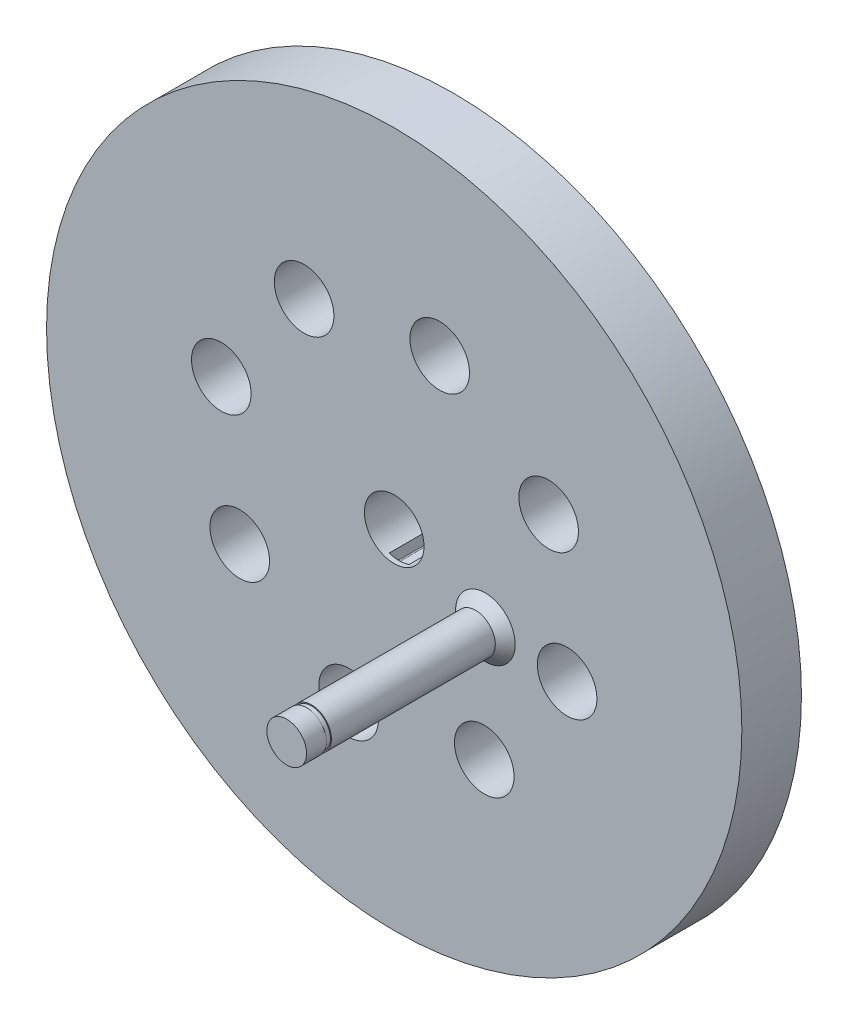
ISO-10303-21;
HEADER;
FILE_DESCRIPTION(('STEP AP214'),'2;1');
FILE_NAME('part.step','',(''),(''),'','','');
FILE_SCHEMA(('AUTOMOTIVE_DESIGN { 1 0 10303 214 1 1 1 1 }'));
ENDSEC;
DATA;
#1=APPLICATION_CONTEXT('core data for automotive mechanical design processes');
#2=APPLICATION_PROTOCOL_DEFINITION('international standard','automotive_design',2000,#1);
#3=PRODUCT_CONTEXT('',#1,'mechanical');
#4=PRODUCT('Part','Part','',(#3));
#5=PRODUCT_RELATED_PRODUCT_CATEGORY('part','',(#4));
#6=PRODUCT_DEFINITION_FORMATION('','',#4);
#7=PRODUCT_DEFINITION_CONTEXT('part definition',#1,'design');
#8=PRODUCT_DEFINITION('design','',#6,#7);
#9=PRODUCT_DEFINITION_SHAPE('','',#8);
#10=(LENGTH_UNIT() NAMED_UNIT(*) SI_UNIT(.MILLI.,.METRE.));
#11=(NAMED_UNIT(*) PLANE_ANGLE_UNIT() SI_UNIT($,.RADIAN.));
#12=(NAMED_UNIT(*) SI_UNIT($,.STERADIAN.) SOLID_ANGLE_UNIT());
#13=UNCERTAINTY_MEASURE_WITH_UNIT(LENGTH_MEASURE(1.E-05),#10,'distance_accuracy_value','');
#14=(GEOMETRIC_REPRESENTATION_CONTEXT(3) GLOBAL_UNCERTAINTY_ASSIGNED_CONTEXT((#13)) GLOBAL_UNIT_ASSIGNED_CONTEXT((#10,
#11,#12)) REPRESENTATION_CONTEXT('',''));
#15=CARTESIAN_POINT('',(0.,0.,0.));
#16=DIRECTION('',(0.,0.,1.));
#17=DIRECTION('',(1.,0.,0.));
#18=AXIS2_PLACEMENT_3D('',#15,#16,#17);
#19=CARTESIAN_POINT('',(9.17867077053944,-3.96887929849786,28.));
#20=DIRECTION('',(0.,0.,-1.));
#21=DIRECTION('',(-1.,0.,0.));
#22=AXIS2_PLACEMENT_3D('',#19,#20,#21);
#23=CYLINDRICAL_SURFACE('',#22,2.);
#24=CARTESIAN_POINT('',(9.17867077053944,-3.96887929849786,6.99999999999997));
#25=DIRECTION('',(0.,0.,1.));
#26=DIRECTION('',(1.,0.,0.));
#27=AXIS2_PLACEMENT_3D('',#24,#25,#26);
#28=CIRCLE('',#27,2.);
#29=CARTESIAN_POINT('',(11.1786707705394,-3.96887929849786,6.99999999999997));
#30=VERTEX_POINT('',#29);
#31=EDGE_CURVE('E266',#30,#30,#28,.T.);
#32=ORIENTED_EDGE('',*,*,#31,.T.);
#33=EDGE_LOOP('',(#32));
#34=FACE_BOUND('',#33,.T.);
#35=CARTESIAN_POINT('',(9.17867077053944,-3.96887929849786,23.5));
#36=DIRECTION('',(0.,0.,1.));
#37=DIRECTION('',(1.,0.,0.));
#38=AXIS2_PLACEMENT_3D('',#35,#36,#37);
#39=CIRCLE('',#38,2.);
#40=CARTESIAN_POINT('',(11.1786707705394,-3.96887929849786,23.5));
#41=VERTEX_POINT('',#40);
#42=EDGE_CURVE('E295',#41,#41,#39,.T.);
#43=ORIENTED_EDGE('',*,*,#42,.F.);
#44=EDGE_LOOP('',(#43));
#45=FACE_BOUND('',#44,.T.);
#46=ADVANCED_FACE('F55',(#34,#45),#23,.T.);
#47=CARTESIAN_POINT('',(0.,0.,6.));
#48=DIRECTION('',(0.,0.,-1.));
#49=DIRECTION('',(-1.,0.,0.));
#50=AXIS2_PLACEMENT_3D('',#47,#48,#49);
#51=CYLINDRICAL_SURFACE('',#50,3.);
#52=CARTESIAN_POINT('',(0.,0.,6.));
#53=DIRECTION('',(0.,0.,1.));
#54=DIRECTION('',(1.,0.,0.));
#55=AXIS2_PLACEMENT_3D('',#52,#53,#54);
#56=CIRCLE('',#55,3.);
#57=CARTESIAN_POINT('',(3.,0.,6.));
#58=VERTEX_POINT('',#57);
#59=EDGE_CURVE('E254',#58,#58,#56,.T.);
#60=ORIENTED_EDGE('',*,*,#59,.T.);
#61=EDGE_LOOP('',(#60));
#62=FACE_BOUND('',#61,.T.);
#63=CARTESIAN_POINT('',(0.,0.,0.));
#64=DIRECTION('',(0.,0.,1.));
#65=DIRECTION('',(1.,0.,0.));
#66=AXIS2_PLACEMENT_3D('',#63,#64,#65);
#67=CIRCLE('',#66,3.);
#68=CARTESIAN_POINT('',(3.,0.,0.));
#69=VERTEX_POINT('',#68);
#70=EDGE_CURVE('E250',#69,#69,#67,.T.);
#71=ORIENTED_EDGE('',*,*,#70,.F.);
#72=EDGE_LOOP('',(#71));
#73=FACE_BOUND('',#72,.T.);
#74=DIRECTION('',(0.,0.,-1.));
#75=VECTOR('',#74,1.);
#76=CARTESIAN_POINT('',(-0.999999999999999,-2.82842712474619,6.));
#77=LINE('',#76,#75);
#78=CARTESIAN_POINT('',(-0.999999999999999,-2.82842712474619,1.5));
#79=VERTEX_POINT('',#78);
#80=CARTESIAN_POINT('',(-0.999999999999999,-2.82842712474619,5.5));
#81=VERTEX_POINT('',#80);
#82=EDGE_CURVE('E132',#79,#81,#77,.F.);
#83=ORIENTED_EDGE('',*,*,#82,.F.);
#84=CARTESIAN_POINT('',(0.,0.,1.5));
#85=DIRECTION('',(0.,0.,1.));
#86=DIRECTION('',(1.,0.,0.));
#87=AXIS2_PLACEMENT_3D('',#84,#85,#86);
#88=CIRCLE('',#87,3.);
#89=CARTESIAN_POINT('',(1.,-2.82842712474619,1.5));
#90=VERTEX_POINT('',#89);
#91=EDGE_CURVE('E136',#79,#90,#88,.T.);
#92=ORIENTED_EDGE('',*,*,#91,.T.);
#93=DIRECTION('',(0.,0.,-1.));
#94=VECTOR('',#93,1.);
#95=CARTESIAN_POINT('',(1.,-2.82842712474619,6.));
#96=LINE('',#95,#94);
#97=CARTESIAN_POINT('',(1.,-2.82842712474619,5.5));
#98=VERTEX_POINT('',#97);
#99=EDGE_CURVE('E116',#98,#90,#96,.T.);
#100=ORIENTED_EDGE('',*,*,#99,.F.);
#101=CARTESIAN_POINT('',(0.,0.,5.5));
#102=DIRECTION('',(0.,0.,1.));
#103=DIRECTION('',(1.,0.,0.));
#104=AXIS2_PLACEMENT_3D('',#101,#102,#103);
#105=CIRCLE('',#104,3.);
#106=EDGE_CURVE('E125',#81,#98,#105,.T.);
#107=ORIENTED_EDGE('',*,*,#106,.F.);
#108=EDGE_LOOP('',(#83,#92,#100,#107));
#109=FACE_BOUND('',#108,.T.);
#110=ADVANCED_FACE('F135',(#62,#73,#109),#51,.F.);
#111=CARTESIAN_POINT('',(0.,0.,6.));
#112=DIRECTION('',(0.,0.,1.));
#113=DIRECTION('',(1.,0.,0.));
#114=AXIS2_PLACEMENT_3D('',#111,#112,#113);
#115=PLANE('',#114);
#116=CARTESIAN_POINT('',(9.17867077053944,-3.96887929849786,6.));
#117=DIRECTION('',(0.,0.,1.));
#118=DIRECTION('',(1.,0.,0.));
#119=AXIS2_PLACEMENT_3D('',#116,#117,#118);
#120=CIRCLE('',#119,2.99999999999996);
#121=CARTESIAN_POINT('',(12.1786707705394,-3.96887929849786,6.));
#122=VERTEX_POINT('',#121);
#123=EDGE_CURVE('E133',#122,#122,#120,.F.);
#124=ORIENTED_EDGE('',*,*,#123,.T.);
#125=EDGE_LOOP('',(#124));
#126=FACE_BOUND('',#125,.T.);
#127=CARTESIAN_POINT('',(15.548658842396,9.06858358305098,6.));
#128=DIRECTION('',(0.,0.,-1.));
#129=DIRECTION('',(-1.,0.,0.));
#130=AXIS2_PLACEMENT_3D('',#127,#128,#129);
#131=CIRCLE('',#130,3.);
#132=CARTESIAN_POINT('',(12.548658842396,9.06858358305098,6.));
#133=VERTEX_POINT('',#132);
#134=EDGE_CURVE('E177',#133,#133,#131,.T.);
#135=ORIENTED_EDGE('',*,*,#134,.T.);
#136=EDGE_LOOP('',(#135));
#137=FACE_BOUND('',#136,.T.);
#138=CARTESIAN_POINT('',(17.4070190531467,-4.58210515848203,6.));
#139=DIRECTION('',(0.,0.,-1.));
#140=DIRECTION('',(-1.,0.,0.));
#141=AXIS2_PLACEMENT_3D('',#138,#139,#140);
#142=CIRCLE('',#141,3.);
#143=CARTESIAN_POINT('',(14.4070190531467,-4.58210515848203,6.));
#144=VERTEX_POINT('',#143);
#145=EDGE_CURVE('E235',#144,#144,#142,.T.);
#146=ORIENTED_EDGE('',*,*,#145,.T.);
#147=EDGE_LOOP('',(#146));
#148=FACE_BOUND('',#147,.T.);
#149=CARTESIAN_POINT('',(9.06858358305099,-15.5486588423959,6.));
#150=DIRECTION('',(0.,0.,-1.));
#151=DIRECTION('',(-1.,0.,0.));
#152=AXIS2_PLACEMENT_3D('',#149,#150,#151);
#153=CIRCLE('',#152,3.);
#154=CARTESIAN_POINT('',(6.06858358305099,-15.5486588423959,6.));
#155=VERTEX_POINT('',#154);
#156=EDGE_CURVE('E227',#155,#155,#153,.T.);
#157=ORIENTED_EDGE('',*,*,#156,.T.);
#158=EDGE_LOOP('',(#157));
#159=FACE_BOUND('',#158,.T.);
#160=CARTESIAN_POINT('',(-4.58210515848203,-17.4070190531467,6.));
#161=DIRECTION('',(0.,0.,-1.));
#162=DIRECTION('',(-1.,0.,0.));
#163=AXIS2_PLACEMENT_3D('',#160,#161,#162);
#164=CIRCLE('',#163,3.);
#165=CARTESIAN_POINT('',(-7.58210515848203,-17.4070190531467,6.));
#166=VERTEX_POINT('',#165);
#167=EDGE_CURVE('E219',#166,#166,#164,.T.);
#168=ORIENTED_EDGE('',*,*,#167,.T.);
#169=EDGE_LOOP('',(#168));
#170=FACE_BOUND('',#169,.T.);
#171=CARTESIAN_POINT('',(-15.548658842396,-9.06858358305097,6.));
#172=DIRECTION('',(0.,0.,-1.));
#173=DIRECTION('',(-1.,0.,0.));
#174=AXIS2_PLACEMENT_3D('',#171,#172,#173);
#175=CIRCLE('',#174,3.);
#176=CARTESIAN_POINT('',(-18.548658842396,-9.06858358305097,6.));
#177=VERTEX_POINT('',#176);
#178=EDGE_CURVE('E211',#177,#177,#175,.T.);
#179=ORIENTED_EDGE('',*,*,#178,.T.);
#180=EDGE_LOOP('',(#179));
#181=FACE_BOUND('',#180,.T.);
#182=CARTESIAN_POINT('',(-17.4070190531467,4.58210515848202,6.));
#183=DIRECTION('',(0.,0.,-1.));
#184=DIRECTION('',(-1.,0.,0.));
#185=AXIS2_PLACEMENT_3D('',#182,#183,#184);
#186=CIRCLE('',#185,2.99999999999999);
#187=CARTESIAN_POINT('',(-20.4070190531467,4.58210515848202,6.));
#188=VERTEX_POINT('',#187);
#189=EDGE_CURVE('E203',#188,#188,#186,.T.);
#190=ORIENTED_EDGE('',*,*,#189,.T.);
#191=EDGE_LOOP('',(#190));
#192=FACE_BOUND('',#191,.T.);
#193=CARTESIAN_POINT('',(-9.06858358305098,15.548658842396,6.));
#194=DIRECTION('',(0.,0.,-1.));
#195=DIRECTION('',(-1.,0.,0.));
#196=AXIS2_PLACEMENT_3D('',#193,#194,#195);
#197=CIRCLE('',#196,3.);
#198=CARTESIAN_POINT('',(-12.068583583051,15.548658842396,6.));
#199=VERTEX_POINT('',#198);
#200=EDGE_CURVE('E195',#199,#199,#197,.T.);
#201=ORIENTED_EDGE('',*,*,#200,.T.);
#202=EDGE_LOOP('',(#201));
#203=FACE_BOUND('',#202,.T.);
#204=CARTESIAN_POINT('',(4.58210515848201,17.4070190531467,6.));
#205=DIRECTION('',(0.,0.,-1.));
#206=DIRECTION('',(-1.,0.,0.));
#207=AXIS2_PLACEMENT_3D('',#204,#205,#206);
#208=CIRCLE('',#207,3.);
#209=CARTESIAN_POINT('',(1.58210515848201,17.4070190531467,6.));
#210=VERTEX_POINT('',#209);
#211=EDGE_CURVE('E246',#210,#210,#208,.T.);
#212=ORIENTED_EDGE('',*,*,#211,.T.);
#213=EDGE_LOOP('',(#212));
#214=FACE_BOUND('',#213,.T.);
#215=CARTESIAN_POINT('',(0.,0.,6.));
#216=DIRECTION('',(0.,0.,1.));
#217=DIRECTION('',(1.,0.,0.));
#218=AXIS2_PLACEMENT_3D('',#215,#216,#217);
#219=CIRCLE('',#218,35.);
#220=CARTESIAN_POINT('',(35.,0.,6.));
#221=VERTEX_POINT('',#220);
#222=EDGE_CURVE('E262',#221,#221,#219,.T.);
#223=ORIENTED_EDGE('',*,*,#222,.T.);
#224=EDGE_LOOP('',(#223));
#225=FACE_BOUND('',#224,.T.);
#226=ORIENTED_EDGE('',*,*,#59,.F.);
#227=EDGE_LOOP('',(#226));
#228=FACE_BOUND('',#227,.T.);
#229=ADVANCED_FACE('F279',(#126,#137,#148,#159,#170,#181,#192,#203,#214,#225,#228),#115,.T.);
#230=CARTESIAN_POINT('',(0.,0.,0.));
#231=DIRECTION('',(0.,0.,1.));
#232=DIRECTION('',(1.,0.,0.));
#233=AXIS2_PLACEMENT_3D('',#230,#231,#232);
#234=PLANE('',#233);
#235=CARTESIAN_POINT('',(15.548658842396,9.06858358305098,0.));
#236=DIRECTION('',(0.,0.,-1.));
#237=DIRECTION('',(-1.,0.,0.));
#238=AXIS2_PLACEMENT_3D('',#235,#236,#237);
#239=CIRCLE('',#238,3.);
#240=CARTESIAN_POINT('',(12.548658842396,9.06858358305098,0.));
#241=VERTEX_POINT('',#240);
#242=EDGE_CURVE('E239',#241,#241,#239,.T.);
#243=ORIENTED_EDGE('',*,*,#242,.F.);
#244=EDGE_LOOP('',(#243));
#245=FACE_BOUND('',#244,.T.);
#246=CARTESIAN_POINT('',(17.4070190531467,-4.58210515848203,0.));
#247=DIRECTION('',(0.,0.,-1.));
#248=DIRECTION('',(-1.,0.,0.));
#249=AXIS2_PLACEMENT_3D('',#246,#247,#248);
#250=CIRCLE('',#249,3.);
#251=CARTESIAN_POINT('',(14.4070190531467,-4.58210515848203,0.));
#252=VERTEX_POINT('',#251);
#253=EDGE_CURVE('E231',#252,#252,#250,.T.);
#254=ORIENTED_EDGE('',*,*,#253,.F.);
#255=EDGE_LOOP('',(#254));
#256=FACE_BOUND('',#255,.T.);
#257=CARTESIAN_POINT('',(9.06858358305099,-15.5486588423959,0.));
#258=DIRECTION('',(0.,0.,-1.));
#259=DIRECTION('',(-1.,0.,0.));
#260=AXIS2_PLACEMENT_3D('',#257,#258,#259);
#261=CIRCLE('',#260,3.);
#262=CARTESIAN_POINT('',(6.06858358305099,-15.5486588423959,0.));
#263=VERTEX_POINT('',#262);
#264=EDGE_CURVE('E223',#263,#263,#261,.T.);
#265=ORIENTED_EDGE('',*,*,#264,.F.);
#266=EDGE_LOOP('',(#265));
#267=FACE_BOUND('',#266,.T.);
#268=CARTESIAN_POINT('',(-4.58210515848203,-17.4070190531467,0.));
#269=DIRECTION('',(0.,0.,-1.));
#270=DIRECTION('',(-1.,0.,0.));
#271=AXIS2_PLACEMENT_3D('',#268,#269,#270);
#272=CIRCLE('',#271,3.);
#273=CARTESIAN_POINT('',(-7.58210515848203,-17.4070190531467,0.));
#274=VERTEX_POINT('',#273);
#275=EDGE_CURVE('E215',#274,#274,#272,.T.);
#276=ORIENTED_EDGE('',*,*,#275,.F.);
#277=EDGE_LOOP('',(#276));
#278=FACE_BOUND('',#277,.T.);
#279=CARTESIAN_POINT('',(-15.548658842396,-9.06858358305097,0.));
#280=DIRECTION('',(0.,0.,-1.));
#281=DIRECTION('',(-1.,0.,0.));
#282=AXIS2_PLACEMENT_3D('',#279,#280,#281);
#283=CIRCLE('',#282,3.);
#284=CARTESIAN_POINT('',(-18.548658842396,-9.06858358305097,0.));
#285=VERTEX_POINT('',#284);
#286=EDGE_CURVE('E207',#285,#285,#283,.T.);
#287=ORIENTED_EDGE('',*,*,#286,.F.);
#288=EDGE_LOOP('',(#287));
#289=FACE_BOUND('',#288,.T.);
#290=CARTESIAN_POINT('',(-17.4070190531467,4.58210515848202,0.));
#291=DIRECTION('',(0.,0.,-1.));
#292=DIRECTION('',(-1.,0.,0.));
#293=AXIS2_PLACEMENT_3D('',#290,#291,#292);
#294=CIRCLE('',#293,2.99999999999999);
#295=CARTESIAN_POINT('',(-20.4070190531467,4.58210515848202,0.));
#296=VERTEX_POINT('',#295);
#297=EDGE_CURVE('E199',#296,#296,#294,.T.);
#298=ORIENTED_EDGE('',*,*,#297,.F.);
#299=EDGE_LOOP('',(#298));
#300=FACE_BOUND('',#299,.T.);
#301=CARTESIAN_POINT('',(-9.06858358305098,15.548658842396,0.));
#302=DIRECTION('',(0.,0.,-1.));
#303=DIRECTION('',(-1.,0.,0.));
#304=AXIS2_PLACEMENT_3D('',#301,#302,#303);
#305=CIRCLE('',#304,3.);
#306=CARTESIAN_POINT('',(-12.068583583051,15.548658842396,0.));
#307=VERTEX_POINT('',#306);
#308=EDGE_CURVE('E190',#307,#307,#305,.T.);
#309=ORIENTED_EDGE('',*,*,#308,.F.);
#310=EDGE_LOOP('',(#309));
#311=FACE_BOUND('',#310,.T.);
#312=CARTESIAN_POINT('',(4.58210515848201,17.4070190531467,0.));
#313=DIRECTION('',(0.,0.,-1.));
#314=DIRECTION('',(-1.,0.,0.));
#315=AXIS2_PLACEMENT_3D('',#312,#313,#314);
#316=CIRCLE('',#315,3.);
#317=CARTESIAN_POINT('',(1.58210515848201,17.4070190531467,0.));
#318=VERTEX_POINT('',#317);
#319=EDGE_CURVE('E194',#318,#318,#316,.T.);
#320=ORIENTED_EDGE('',*,*,#319,.F.);
#321=EDGE_LOOP('',(#320));
#322=FACE_BOUND('',#321,.T.);
#323=CARTESIAN_POINT('',(0.,0.,0.));
#324=DIRECTION('',(0.,0.,1.));
#325=DIRECTION('',(1.,0.,0.));
#326=AXIS2_PLACEMENT_3D('',#323,#324,#325);
#327=CIRCLE('',#326,35.);
#328=CARTESIAN_POINT('',(35.,0.,0.));
#329=VERTEX_POINT('',#328);
#330=EDGE_CURVE('E258',#329,#329,#327,.T.);
#331=ORIENTED_EDGE('',*,*,#330,.F.);
#332=EDGE_LOOP('',(#331));
#333=FACE_BOUND('',#332,.T.);
#334=ORIENTED_EDGE('',*,*,#70,.T.);
#335=EDGE_LOOP('',(#334));
#336=FACE_BOUND('',#335,.T.);
#337=ADVANCED_FACE('F409',(#245,#256,#267,#278,#289,#300,#311,#322,#333,#336),#234,.F.);
#338=CARTESIAN_POINT('',(0.,0.,6.));
#339=DIRECTION('',(0.,0.,-1.));
#340=DIRECTION('',(-1.,0.,0.));
#341=AXIS2_PLACEMENT_3D('',#338,#339,#340);
#342=CYLINDRICAL_SURFACE('',#341,35.);
#343=ORIENTED_EDGE('',*,*,#222,.F.);
#344=EDGE_LOOP('',(#343));
#345=FACE_BOUND('',#344,.T.);
#346=ORIENTED_EDGE('',*,*,#330,.T.);
#347=EDGE_LOOP('',(#346));
#348=FACE_BOUND('',#347,.T.);
#349=ADVANCED_FACE('F402',(#345,#348),#342,.T.);
#350=CARTESIAN_POINT('',(4.58210515848201,17.4070190531467,6.));
#351=DIRECTION('',(0.,0.,-1.));
#352=DIRECTION('',(-1.,0.,0.));
#353=AXIS2_PLACEMENT_3D('',#350,#351,#352);
#354=CYLINDRICAL_SURFACE('',#353,3.);
#355=ORIENTED_EDGE('',*,*,#211,.F.);
#356=EDGE_LOOP('',(#355));
#357=FACE_BOUND('',#356,.T.);
#358=ORIENTED_EDGE('',*,*,#319,.T.);
#359=EDGE_LOOP('',(#358));
#360=FACE_BOUND('',#359,.T.);
#361=ADVANCED_FACE('F376',(#357,#360),#354,.F.);
#362=CARTESIAN_POINT('',(-9.06858358305098,15.548658842396,6.));
#363=DIRECTION('',(0.,0.,-1.));
#364=DIRECTION('',(-1.,0.,0.));
#365=AXIS2_PLACEMENT_3D('',#362,#363,#364);
#366=CYLINDRICAL_SURFACE('',#365,3.);
#367=ORIENTED_EDGE('',*,*,#200,.F.);
#368=EDGE_LOOP('',(#367));
#369=FACE_BOUND('',#368,.T.);
#370=ORIENTED_EDGE('',*,*,#308,.T.);
#371=EDGE_LOOP('',(#370));
#372=FACE_BOUND('',#371,.T.);
#373=ADVANCED_FACE('F372',(#369,#372),#366,.F.);
#374=CARTESIAN_POINT('',(-17.4070190531467,4.58210515848202,6.));
#375=DIRECTION('',(0.,0.,-1.));
#376=DIRECTION('',(-1.,0.,0.));
#377=AXIS2_PLACEMENT_3D('',#374,#375,#376);
#378=CYLINDRICAL_SURFACE('',#377,2.99999999999999);
#379=ORIENTED_EDGE('',*,*,#189,.F.);
#380=EDGE_LOOP('',(#379));
#381=FACE_BOUND('',#380,.T.);
#382=ORIENTED_EDGE('',*,*,#297,.T.);
#383=EDGE_LOOP('',(#382));
#384=FACE_BOUND('',#383,.T.);
#385=ADVANCED_FACE('F375',(#381,#384),#378,.F.);
#386=CARTESIAN_POINT('',(-15.548658842396,-9.06858358305097,6.));
#387=DIRECTION('',(0.,0.,-1.));
#388=DIRECTION('',(-1.,0.,0.));
#389=AXIS2_PLACEMENT_3D('',#386,#387,#388);
#390=CYLINDRICAL_SURFACE('',#389,3.);
#391=ORIENTED_EDGE('',*,*,#178,.F.);
#392=EDGE_LOOP('',(#391));
#393=FACE_BOUND('',#392,.T.);
#394=ORIENTED_EDGE('',*,*,#286,.T.);
#395=EDGE_LOOP('',(#394));
#396=FACE_BOUND('',#395,.T.);
#397=ADVANCED_FACE('F380',(#393,#396),#390,.F.);
#398=CARTESIAN_POINT('',(-4.58210515848203,-17.4070190531467,6.));
#399=DIRECTION('',(0.,0.,-1.));
#400=DIRECTION('',(-1.,0.,0.));
#401=AXIS2_PLACEMENT_3D('',#398,#399,#400);
#402=CYLINDRICAL_SURFACE('',#401,3.);
#403=ORIENTED_EDGE('',*,*,#167,.F.);
#404=EDGE_LOOP('',(#403));
#405=FACE_BOUND('',#404,.T.);
#406=ORIENTED_EDGE('',*,*,#275,.T.);
#407=EDGE_LOOP('',(#406));
#408=FACE_BOUND('',#407,.T.);
#409=ADVANCED_FACE('F384',(#405,#408),#402,.F.);
#410=CARTESIAN_POINT('',(9.06858358305099,-15.5486588423959,6.));
#411=DIRECTION('',(0.,0.,-1.));
#412=DIRECTION('',(-1.,0.,0.));
#413=AXIS2_PLACEMENT_3D('',#410,#411,#412);
#414=CYLINDRICAL_SURFACE('',#413,3.);
#415=ORIENTED_EDGE('',*,*,#156,.F.);
#416=EDGE_LOOP('',(#415));
#417=FACE_BOUND('',#416,.T.);
#418=ORIENTED_EDGE('',*,*,#264,.T.);
#419=EDGE_LOOP('',(#418));
#420=FACE_BOUND('',#419,.T.);
#421=ADVANCED_FACE('F388',(#417,#420),#414,.F.);
#422=CARTESIAN_POINT('',(17.4070190531467,-4.58210515848203,6.));
#423=DIRECTION('',(0.,0.,-1.));
#424=DIRECTION('',(-1.,0.,0.));
#425=AXIS2_PLACEMENT_3D('',#422,#423,#424);
#426=CYLINDRICAL_SURFACE('',#425,3.);
#427=ORIENTED_EDGE('',*,*,#145,.F.);
#428=EDGE_LOOP('',(#427));
#429=FACE_BOUND('',#428,.T.);
#430=ORIENTED_EDGE('',*,*,#253,.T.);
#431=EDGE_LOOP('',(#430));
#432=FACE_BOUND('',#431,.T.);
#433=ADVANCED_FACE('F392',(#429,#432),#426,.F.);
#434=CARTESIAN_POINT('',(15.548658842396,9.06858358305098,6.));
#435=DIRECTION('',(0.,0.,-1.));
#436=DIRECTION('',(-1.,0.,0.));
#437=AXIS2_PLACEMENT_3D('',#434,#435,#436);
#438=CYLINDRICAL_SURFACE('',#437,3.);
#439=ORIENTED_EDGE('',*,*,#134,.F.);
#440=EDGE_LOOP('',(#439));
#441=FACE_BOUND('',#440,.T.);
#442=ORIENTED_EDGE('',*,*,#242,.T.);
#443=EDGE_LOOP('',(#442));
#444=FACE_BOUND('',#443,.T.);
#445=ADVANCED_FACE('F285',(#441,#444),#438,.F.);
#446=CARTESIAN_POINT('',(9.17867077053944,-3.96887929849786,6.99999999999997));
#447=DIRECTION('',(0.,0.,-1.));
#448=DIRECTION('',(-1.,0.,0.));
#449=AXIS2_PLACEMENT_3D('',#446,#447,#448);
#450=CONICAL_SURFACE('',#449,2.,0.785398163397444);
#451=ORIENTED_EDGE('',*,*,#123,.F.);
#452=EDGE_LOOP('',(#451));
#453=FACE_BOUND('',#452,.T.);
#454=ORIENTED_EDGE('',*,*,#31,.F.);
#455=EDGE_LOOP('',(#454));
#456=FACE_BOUND('',#455,.T.);
#457=ADVANCED_FACE('F282',(#453,#456),#450,.T.);
#458=CARTESIAN_POINT('',(1.,-2.,1.5));
#459=DIRECTION('',(1.,0.,0.));
#460=DIRECTION('',(0.,0.,-1.));
#461=AXIS2_PLACEMENT_3D('',#458,#459,#460);
#462=PLANE('',#461);
#463=DIRECTION('',(0.,1.,0.));
#464=VECTOR('',#463,1.);
#465=CARTESIAN_POINT('',(1.,-2.,1.5));
#466=LINE('',#465,#464);
#467=CARTESIAN_POINT('',(1.,-3.9,1.5));
#468=VERTEX_POINT('',#467);
#469=EDGE_CURVE('E187',#468,#90,#466,.T.);
#470=ORIENTED_EDGE('',*,*,#469,.F.);
#471=DIRECTION('',(0.,0.,1.));
#472=VECTOR('',#471,1.);
#473=CARTESIAN_POINT('',(1.,-3.9,5.5));
#474=LINE('',#473,#472);
#475=CARTESIAN_POINT('',(1.,-3.9,5.5));
#476=VERTEX_POINT('',#475);
#477=EDGE_CURVE('E11',#468,#476,#474,.T.);
#478=ORIENTED_EDGE('',*,*,#477,.T.);
#479=DIRECTION('',(0.,1.,0.));
#480=VECTOR('',#479,1.);
#481=CARTESIAN_POINT('',(1.,-2.,5.5));
#482=LINE('',#481,#480);
#483=EDGE_CURVE('E112',#476,#98,#482,.T.);
#484=ORIENTED_EDGE('',*,*,#483,.T.);
#485=ORIENTED_EDGE('',*,*,#99,.T.);
#486=EDGE_LOOP('',(#470,#478,#484,#485));
#487=FACE_BOUND('',#486,.T.);
#488=ADVANCED_FACE('F114',(#487),#462,.F.);
#489=CARTESIAN_POINT('',(-0.999999999999999,-4.,1.5));
#490=DIRECTION('',(0.,-1.,0.));
#491=DIRECTION('',(0.,0.,-1.));
#492=AXIS2_PLACEMENT_3D('',#489,#490,#491);
#493=PLANE('',#492);
#494=DIRECTION('',(1.,0.,0.));
#495=VECTOR('',#494,1.);
#496=CARTESIAN_POINT('',(-0.999999999999999,-4.,1.5));
#497=LINE('',#496,#495);
#498=CARTESIAN_POINT('',(-0.899999999999999,-4.,1.5));
#499=VERTEX_POINT('',#498);
#500=CARTESIAN_POINT('',(0.900000000000001,-4.,1.5));
#501=VERTEX_POINT('',#500);
#502=EDGE_CURVE('E168',#499,#501,#497,.T.);
#503=ORIENTED_EDGE('',*,*,#502,.F.);
#504=DIRECTION('',(0.,0.,1.));
#505=VECTOR('',#504,1.);
#506=CARTESIAN_POINT('',(-0.899999999999999,-4.,5.5));
#507=LINE('',#506,#505);
#508=CARTESIAN_POINT('',(-0.899999999999999,-4.,5.5));
#509=VERTEX_POINT('',#508);
#510=EDGE_CURVE('E149',#499,#509,#507,.T.);
#511=ORIENTED_EDGE('',*,*,#510,.T.);
#512=DIRECTION('',(1.,0.,0.));
#513=VECTOR('',#512,1.);
#514=CARTESIAN_POINT('',(-0.999999999999999,-4.,5.5));
#515=LINE('',#514,#513);
#516=CARTESIAN_POINT('',(0.900000000000001,-4.,5.5));
#517=VERTEX_POINT('',#516);
#518=EDGE_CURVE('E180',#509,#517,#515,.T.);
#519=ORIENTED_EDGE('',*,*,#518,.T.);
#520=DIRECTION('',(0.,0.,1.));
#521=VECTOR('',#520,1.);
#522=CARTESIAN_POINT('',(0.900000000000001,-4.,1.5));
#523=LINE('',#522,#521);
#524=EDGE_CURVE('E143',#517,#501,#523,.F.);
#525=ORIENTED_EDGE('',*,*,#524,.T.);
#526=EDGE_LOOP('',(#503,#511,#519,#525));
#527=FACE_BOUND('',#526,.T.);
#528=ADVANCED_FACE('F173',(#527),#493,.F.);
#529=CARTESIAN_POINT('',(-0.999999999999999,-2.,1.5));
#530=DIRECTION('',(-1.,0.,0.));
#531=DIRECTION('',(0.,0.,1.));
#532=AXIS2_PLACEMENT_3D('',#529,#530,#531);
#533=PLANE('',#532);
#534=DIRECTION('',(0.,-1.,0.));
#535=VECTOR('',#534,1.);
#536=CARTESIAN_POINT('',(-0.999999999999999,-2.,5.5));
#537=LINE('',#536,#535);
#538=CARTESIAN_POINT('',(-0.999999999999999,-3.9,5.5));
#539=VERTEX_POINT('',#538);
#540=EDGE_CURVE('E121',#81,#539,#537,.T.);
#541=ORIENTED_EDGE('',*,*,#540,.T.);
#542=DIRECTION('',(0.,0.,1.));
#543=VECTOR('',#542,1.);
#544=CARTESIAN_POINT('',(-0.999999999999999,-3.9,1.5));
#545=LINE('',#544,#543);
#546=CARTESIAN_POINT('',(-0.999999999999999,-3.9,1.5));
#547=VERTEX_POINT('',#546);
#548=EDGE_CURVE('E79',#539,#547,#545,.F.);
#549=ORIENTED_EDGE('',*,*,#548,.T.);
#550=DIRECTION('',(0.,-1.,0.));
#551=VECTOR('',#550,1.);
#552=CARTESIAN_POINT('',(-0.999999999999999,-2.,1.5));
#553=LINE('',#552,#551);
#554=EDGE_CURVE('E169',#79,#547,#553,.T.);
#555=ORIENTED_EDGE('',*,*,#554,.F.);
#556=ORIENTED_EDGE('',*,*,#82,.T.);
#557=EDGE_LOOP('',(#541,#549,#555,#556));
#558=FACE_BOUND('',#557,.T.);
#559=ADVANCED_FACE('F181',(#558),#533,.F.);
#560=CARTESIAN_POINT('',(0.,0.,1.5));
#561=DIRECTION('',(0.,0.,1.));
#562=DIRECTION('',(1.,0.,0.));
#563=AXIS2_PLACEMENT_3D('',#560,#561,#562);
#564=PLANE('',#563);
#565=ORIENTED_EDGE('',*,*,#554,.T.);
#566=CARTESIAN_POINT('',(-0.899999999999999,-3.9,1.5));
#567=DIRECTION('',(0.,0.,1.));
#568=DIRECTION('',(1.,0.,0.));
#569=AXIS2_PLACEMENT_3D('',#566,#567,#568);
#570=CIRCLE('',#569,0.1);
#571=EDGE_CURVE('E64',#547,#499,#570,.T.);
#572=ORIENTED_EDGE('',*,*,#571,.T.);
#573=ORIENTED_EDGE('',*,*,#502,.T.);
#574=CARTESIAN_POINT('',(0.900000000000001,-3.9,1.5));
#575=DIRECTION('',(0.,0.,1.));
#576=DIRECTION('',(1.,0.,0.));
#577=AXIS2_PLACEMENT_3D('',#574,#575,#576);
#578=CIRCLE('',#577,0.1);
#579=EDGE_CURVE('E71',#501,#468,#578,.T.);
#580=ORIENTED_EDGE('',*,*,#579,.T.);
#581=ORIENTED_EDGE('',*,*,#469,.T.);
#582=ORIENTED_EDGE('',*,*,#91,.F.);
#583=EDGE_LOOP('',(#565,#572,#573,#580,#581,#582));
#584=FACE_BOUND('',#583,.T.);
#585=ADVANCED_FACE('F167',(#584),#564,.T.);
#586=CARTESIAN_POINT('',(0.,0.,5.5));
#587=DIRECTION('',(0.,0.,1.));
#588=DIRECTION('',(1.,0.,0.));
#589=AXIS2_PLACEMENT_3D('',#586,#587,#588);
#590=PLANE('',#589);
#591=ORIENTED_EDGE('',*,*,#518,.F.);
#592=CARTESIAN_POINT('',(-0.899999999999999,-3.9,5.5));
#593=DIRECTION('',(0.,0.,1.));
#594=DIRECTION('',(1.,0.,0.));
#595=AXIS2_PLACEMENT_3D('',#592,#593,#594);
#596=CIRCLE('',#595,0.1);
#597=EDGE_CURVE('E156',#509,#539,#596,.F.);
#598=ORIENTED_EDGE('',*,*,#597,.T.);
#599=ORIENTED_EDGE('',*,*,#540,.F.);
#600=ORIENTED_EDGE('',*,*,#106,.T.);
#601=ORIENTED_EDGE('',*,*,#483,.F.);
#602=CARTESIAN_POINT('',(0.900000000000001,-3.9,5.5));
#603=DIRECTION('',(0.,0.,1.));
#604=DIRECTION('',(1.,0.,0.));
#605=AXIS2_PLACEMENT_3D('',#602,#603,#604);
#606=CIRCLE('',#605,0.1);
#607=EDGE_CURVE('E153',#476,#517,#606,.F.);
#608=ORIENTED_EDGE('',*,*,#607,.T.);
#609=EDGE_LOOP('',(#591,#598,#599,#600,#601,#608));
#610=FACE_BOUND('',#609,.T.);
#611=ADVANCED_FACE('F127',(#610),#590,.F.);
#612=CARTESIAN_POINT('',(-0.899999999999999,-3.9,1.5));
#613=DIRECTION('',(0.,0.,-1.));
#614=DIRECTION('',(-1.,0.,0.));
#615=AXIS2_PLACEMENT_3D('',#612,#613,#614);
#616=CYLINDRICAL_SURFACE('',#615,0.1);
#617=ORIENTED_EDGE('',*,*,#571,.F.);
#618=ORIENTED_EDGE('',*,*,#548,.F.);
#619=ORIENTED_EDGE('',*,*,#597,.F.);
#620=ORIENTED_EDGE('',*,*,#510,.F.);
#621=EDGE_LOOP('',(#617,#618,#619,#620));
#622=FACE_BOUND('',#621,.T.);
#623=ADVANCED_FACE('F179',(#622),#616,.F.);
#624=CARTESIAN_POINT('',(0.900000000000001,-3.9,1.5));
#625=DIRECTION('',(0.,0.,-1.));
#626=DIRECTION('',(-1.,0.,0.));
#627=AXIS2_PLACEMENT_3D('',#624,#625,#626);
#628=CYLINDRICAL_SURFACE('',#627,0.1);
#629=ORIENTED_EDGE('',*,*,#579,.F.);
#630=ORIENTED_EDGE('',*,*,#524,.F.);
#631=ORIENTED_EDGE('',*,*,#607,.F.);
#632=ORIENTED_EDGE('',*,*,#477,.F.);
#633=EDGE_LOOP('',(#629,#630,#631,#632));
#634=FACE_BOUND('',#633,.T.);
#635=ADVANCED_FACE('F57',(#634),#628,.F.);
#636=CARTESIAN_POINT('',(9.17867077053944,-3.96887929849786,23.5));
#637=DIRECTION('',(0.,0.,1.));
#638=DIRECTION('',(1.,0.,0.));
#639=AXIS2_PLACEMENT_3D('',#636,#637,#638);
#640=PLANE('',#639);
#641=CARTESIAN_POINT('',(9.17867077053944,-3.96887929849786,23.5));
#642=DIRECTION('',(0.,0.,1.));
#643=DIRECTION('',(1.,0.,0.));
#644=AXIS2_PLACEMENT_3D('',#641,#642,#643);
#645=CIRCLE('',#644,1.9);
#646=CARTESIAN_POINT('',(11.0786707705394,-3.96887929849786,23.5));
#647=VERTEX_POINT('',#646);
#648=EDGE_CURVE('E307',#647,#647,#645,.T.);
#649=ORIENTED_EDGE('',*,*,#648,.F.);
#650=EDGE_LOOP('',(#649));
#651=FACE_BOUND('',#650,.T.);
#652=ORIENTED_EDGE('',*,*,#42,.T.);
#653=EDGE_LOOP('',(#652));
#654=FACE_BOUND('',#653,.T.);
#655=ADVANCED_FACE('F355',(#651,#654),#640,.T.);
#656=CARTESIAN_POINT('',(9.17867077053944,-3.96887929849786,24.));
#657=DIRECTION('',(0.,0.,1.));
#658=DIRECTION('',(1.,0.,0.));
#659=AXIS2_PLACEMENT_3D('',#656,#657,#658);
#660=PLANE('',#659);
#661=CARTESIAN_POINT('',(9.17867077053944,-3.96887929849786,24.));
#662=DIRECTION('',(0.,0.,1.));
#663=DIRECTION('',(1.,0.,0.));
#664=AXIS2_PLACEMENT_3D('',#661,#662,#663);
#665=CIRCLE('',#664,1.9);
#666=CARTESIAN_POINT('',(11.0786707705394,-3.96887929849786,24.));
#667=VERTEX_POINT('',#666);
#668=EDGE_CURVE('E310',#667,#667,#665,.T.);
#669=ORIENTED_EDGE('',*,*,#668,.T.);
#670=EDGE_LOOP('',(#669));
#671=FACE_BOUND('',#670,.T.);
#672=CARTESIAN_POINT('',(9.17867077053944,-3.96887929849786,24.));
#673=DIRECTION('',(0.,0.,1.));
#674=DIRECTION('',(1.,0.,0.));
#675=AXIS2_PLACEMENT_3D('',#672,#673,#674);
#676=CIRCLE('',#675,2.);
#677=CARTESIAN_POINT('',(11.1786707705394,-3.96887929849786,24.));
#678=VERTEX_POINT('',#677);
#679=EDGE_CURVE('E298',#678,#678,#676,.T.);
#680=ORIENTED_EDGE('',*,*,#679,.F.);
#681=EDGE_LOOP('',(#680));
#682=FACE_BOUND('',#681,.T.);
#683=ADVANCED_FACE('F340',(#671,#682),#660,.F.);
#684=CARTESIAN_POINT('',(9.17867077053944,-3.96887929849786,23.5));
#685=DIRECTION('',(0.,0.,1.));
#686=DIRECTION('',(1.,0.,0.));
#687=AXIS2_PLACEMENT_3D('',#684,#685,#686);
#688=CYLINDRICAL_SURFACE('',#687,1.9);
#689=ORIENTED_EDGE('',*,*,#648,.T.);
#690=EDGE_LOOP('',(#689));
#691=FACE_BOUND('',#690,.T.);
#692=ORIENTED_EDGE('',*,*,#668,.F.);
#693=EDGE_LOOP('',(#692));
#694=FACE_BOUND('',#693,.T.);
#695=ADVANCED_FACE('F343',(#691,#694),#688,.T.);
#696=CARTESIAN_POINT('',(9.17867077053944,-3.96887929849786,26.));
#697=DIRECTION('',(0.,0.,1.));
#698=DIRECTION('',(1.,0.,0.));
#699=AXIS2_PLACEMENT_3D('',#696,#697,#698);
#700=PLANE('',#699);
#701=CARTESIAN_POINT('',(9.17867077053944,-3.96887929849786,26.));
#702=DIRECTION('',(0.,0.,1.));
#703=DIRECTION('',(1.,0.,0.));
#704=AXIS2_PLACEMENT_3D('',#701,#702,#703);
#705=CIRCLE('',#704,2.);
#706=CARTESIAN_POINT('',(11.1786707705394,-3.96887929849786,26.));
#707=VERTEX_POINT('',#706);
#708=EDGE_CURVE('E122',#707,#707,#705,.T.);
#709=ORIENTED_EDGE('',*,*,#708,.T.);
#710=EDGE_LOOP('',(#709));
#711=FACE_BOUND('',#710,.T.);
#712=ADVANCED_FACE('F345',(#711),#700,.T.);
#713=ORIENTED_EDGE('',*,*,#679,.T.);
#714=EDGE_LOOP('',(#713));
#715=FACE_BOUND('',#714,.T.);
#716=ORIENTED_EDGE('',*,*,#708,.F.);
#717=EDGE_LOOP('',(#716));
#718=FACE_BOUND('',#717,.T.);
#719=ADVANCED_FACE('F292',(#715,#718),#23,.T.);
#720=CLOSED_SHELL('',(#46,#110,#229,#337,#349,#361,#373,#385,#397,#409,#421,#433,#445,#457,#488,
#528,#559,#585,#611,#623,#635,#655,#683,#695,#712,#719));
#721=MANIFOLD_SOLID_BREP('B2',#720);
#722=ADVANCED_BREP_SHAPE_REPRESENTATION('',(#18,#721),#14);
#723=SHAPE_DEFINITION_REPRESENTATION(#9,#722);
ENDSEC;
END-ISO-10303-21;
